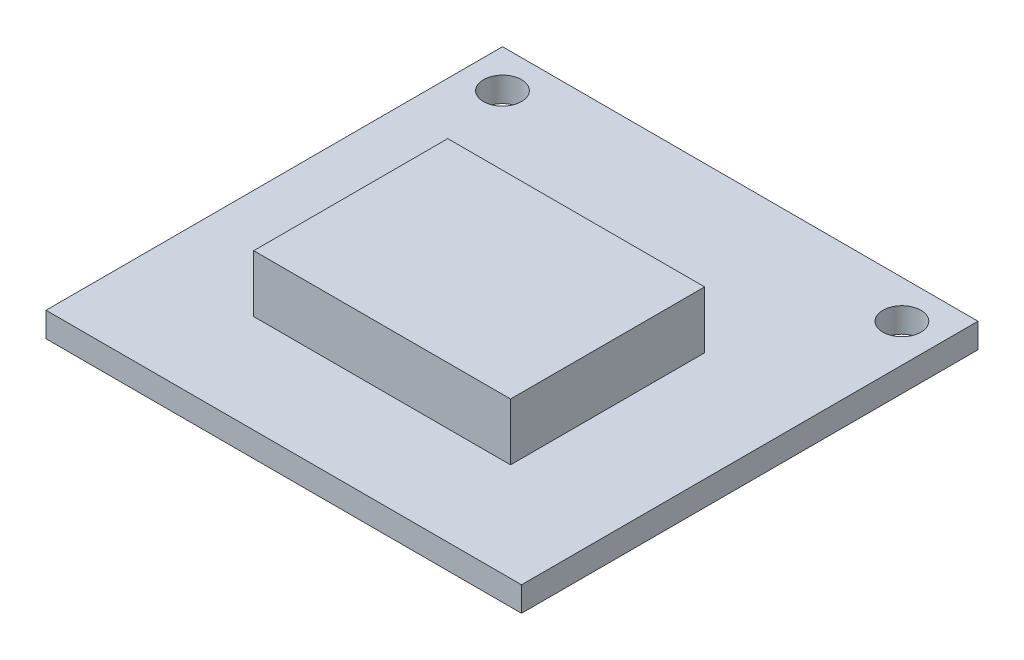
ISO-10303-21;
HEADER;
FILE_DESCRIPTION(('STEP AP214'),'2;1');
FILE_NAME('part.step','',(''),(''),'','','');
FILE_SCHEMA(('AUTOMOTIVE_DESIGN { 1 0 10303 214 1 1 1 1 }'));
ENDSEC;
DATA;
#1=APPLICATION_CONTEXT('core data for automotive mechanical design processes');
#2=APPLICATION_PROTOCOL_DEFINITION('international standard','automotive_design',2000,#1);
#3=PRODUCT_CONTEXT('',#1,'mechanical');
#4=PRODUCT('Part','Part','',(#3));
#5=PRODUCT_RELATED_PRODUCT_CATEGORY('part','',(#4));
#6=PRODUCT_DEFINITION_FORMATION('','',#4);
#7=PRODUCT_DEFINITION_CONTEXT('part definition',#1,'design');
#8=PRODUCT_DEFINITION('design','',#6,#7);
#9=PRODUCT_DEFINITION_SHAPE('','',#8);
#10=(LENGTH_UNIT() NAMED_UNIT(*) SI_UNIT(.MILLI.,.METRE.));
#11=(NAMED_UNIT(*) PLANE_ANGLE_UNIT() SI_UNIT($,.RADIAN.));
#12=(NAMED_UNIT(*) SI_UNIT($,.STERADIAN.) SOLID_ANGLE_UNIT());
#13=UNCERTAINTY_MEASURE_WITH_UNIT(LENGTH_MEASURE(1.E-05),#10,'distance_accuracy_value','');
#14=(GEOMETRIC_REPRESENTATION_CONTEXT(3) GLOBAL_UNCERTAINTY_ASSIGNED_CONTEXT((#13)) GLOBAL_UNIT_ASSIGNED_CONTEXT((#10,
#11,#12)) REPRESENTATION_CONTEXT('',''));
#15=CARTESIAN_POINT('',(0.,0.,0.));
#16=DIRECTION('',(0.,0.,1.));
#17=DIRECTION('',(1.,0.,0.));
#18=AXIS2_PLACEMENT_3D('',#15,#16,#17);
#19=CARTESIAN_POINT('',(0.,1.3,0.));
#20=DIRECTION('',(0.,1.,0.));
#21=DIRECTION('',(0.,0.,1.));
#22=AXIS2_PLACEMENT_3D('',#19,#20,#21);
#23=PLANE('',#22);
#24=DIRECTION('',(0.,0.,-1.));
#25=VECTOR('',#24,1.);
#26=CARTESIAN_POINT('',(6.75144220074146,1.3,-3.37572110037073));
#27=LINE('',#26,#25);
#28=CARTESIAN_POINT('',(6.75144220074146,1.3,6.82874879082627));
#29=VERTEX_POINT('',#28);
#30=CARTESIAN_POINT('',(6.75144220074146,1.3,-3.37572110037073));
#31=VERTEX_POINT('',#30);
#32=EDGE_CURVE('E53',#29,#31,#27,.T.);
#33=ORIENTED_EDGE('',*,*,#32,.F.);
#34=DIRECTION('',(1.,0.,0.));
#35=VECTOR('',#34,1.);
#36=CARTESIAN_POINT('',(-6.75144220074146,1.3,6.82874879082628));
#37=LINE('',#36,#35);
#38=CARTESIAN_POINT('',(-6.75144220074146,1.3,6.82874879082628));
#39=VERTEX_POINT('',#38);
#40=EDGE_CURVE('E59',#39,#29,#37,.T.);
#41=ORIENTED_EDGE('',*,*,#40,.F.);
#42=DIRECTION('',(0.,0.,1.));
#43=VECTOR('',#42,1.);
#44=CARTESIAN_POINT('',(-6.75144220074146,1.3,-3.37572110037073));
#45=LINE('',#44,#43);
#46=CARTESIAN_POINT('',(-6.75144220074146,1.3,-3.37572110037073));
#47=VERTEX_POINT('',#46);
#48=EDGE_CURVE('E307',#47,#39,#45,.T.);
#49=ORIENTED_EDGE('',*,*,#48,.F.);
#50=DIRECTION('',(-1.,0.,0.));
#51=VECTOR('',#50,1.);
#52=CARTESIAN_POINT('',(-6.75144220074146,1.3,-3.37572110037073));
#53=LINE('',#52,#51);
#54=EDGE_CURVE('E311',#31,#47,#53,.T.);
#55=ORIENTED_EDGE('',*,*,#54,.F.);
#56=EDGE_LOOP('',(#33,#41,#49,#55));
#57=FACE_BOUND('',#56,.T.);
#58=CARTESIAN_POINT('',(10.5,1.3,-10.));
#59=DIRECTION('',(0.,1.,0.));
#60=DIRECTION('',(0.,0.,1.));
#61=AXIS2_PLACEMENT_3D('',#58,#59,#60);
#62=CIRCLE('',#61,1.);
#63=CARTESIAN_POINT('',(10.5,1.3,-9.));
#64=VERTEX_POINT('',#63);
#65=EDGE_CURVE('E137',#64,#64,#62,.T.);
#66=ORIENTED_EDGE('',*,*,#65,.F.);
#67=EDGE_LOOP('',(#66));
#68=FACE_BOUND('',#67,.T.);
#69=DIRECTION('',(0.,0.,-1.));
#70=VECTOR('',#69,1.);
#71=CARTESIAN_POINT('',(12.5,1.3,-12.));
#72=LINE('',#71,#70);
#73=CARTESIAN_POINT('',(12.5,1.3,12.));
#74=VERTEX_POINT('',#73);
#75=CARTESIAN_POINT('',(12.5,1.3,-12.));
#76=VERTEX_POINT('',#75);
#77=EDGE_CURVE('E142',#74,#76,#72,.T.);
#78=ORIENTED_EDGE('',*,*,#77,.T.);
#79=DIRECTION('',(-1.,0.,0.));
#80=VECTOR('',#79,1.);
#81=CARTESIAN_POINT('',(-12.5,1.3,-12.));
#82=LINE('',#81,#80);
#83=CARTESIAN_POINT('',(-12.5,1.3,-12.));
#84=VERTEX_POINT('',#83);
#85=EDGE_CURVE('E144',#76,#84,#82,.T.);
#86=ORIENTED_EDGE('',*,*,#85,.T.);
#87=DIRECTION('',(0.,0.,1.));
#88=VECTOR('',#87,1.);
#89=CARTESIAN_POINT('',(-12.5,1.3,-12.));
#90=LINE('',#89,#88);
#91=CARTESIAN_POINT('',(-12.5,1.3,12.));
#92=VERTEX_POINT('',#91);
#93=EDGE_CURVE('E146',#84,#92,#90,.T.);
#94=ORIENTED_EDGE('',*,*,#93,.T.);
#95=DIRECTION('',(1.,0.,0.));
#96=VECTOR('',#95,1.);
#97=CARTESIAN_POINT('',(-12.5,1.3,12.));
#98=LINE('',#97,#96);
#99=EDGE_CURVE('E147',#92,#74,#98,.T.);
#100=ORIENTED_EDGE('',*,*,#99,.T.);
#101=EDGE_LOOP('',(#78,#86,#94,#100));
#102=FACE_BOUND('',#101,.T.);
#103=CARTESIAN_POINT('',(-10.5,1.3,-10.));
#104=DIRECTION('',(0.,1.,0.));
#105=DIRECTION('',(0.,0.,-1.));
#106=AXIS2_PLACEMENT_3D('',#103,#104,#105);
#107=CIRCLE('',#106,1.);
#108=CARTESIAN_POINT('',(-10.5,1.3,-11.));
#109=VERTEX_POINT('',#108);
#110=EDGE_CURVE('E130',#109,#109,#107,.T.);
#111=ORIENTED_EDGE('',*,*,#110,.F.);
#112=EDGE_LOOP('',(#111));
#113=FACE_BOUND('',#112,.T.);
#114=ADVANCED_FACE('F39',(#57,#68,#102,#113),#23,.T.);
#115=CARTESIAN_POINT('',(0.,0.,0.));
#116=DIRECTION('',(0.,1.,0.));
#117=DIRECTION('',(0.,0.,1.));
#118=AXIS2_PLACEMENT_3D('',#115,#116,#117);
#119=PLANE('',#118);
#120=DIRECTION('',(0.,0.,-1.));
#121=VECTOR('',#120,1.);
#122=CARTESIAN_POINT('',(12.5,0.,-12.));
#123=LINE('',#122,#121);
#124=CARTESIAN_POINT('',(12.5,0.,12.));
#125=VERTEX_POINT('',#124);
#126=CARTESIAN_POINT('',(12.5,0.,-12.));
#127=VERTEX_POINT('',#126);
#128=EDGE_CURVE('E139',#125,#127,#123,.T.);
#129=ORIENTED_EDGE('',*,*,#128,.F.);
#130=DIRECTION('',(1.,0.,0.));
#131=VECTOR('',#130,1.);
#132=CARTESIAN_POINT('',(-12.5,0.,12.));
#133=LINE('',#132,#131);
#134=CARTESIAN_POINT('',(-12.5,0.,12.));
#135=VERTEX_POINT('',#134);
#136=EDGE_CURVE('E148',#135,#125,#133,.T.);
#137=ORIENTED_EDGE('',*,*,#136,.F.);
#138=DIRECTION('',(0.,0.,1.));
#139=VECTOR('',#138,1.);
#140=CARTESIAN_POINT('',(-12.5,0.,-12.));
#141=LINE('',#140,#139);
#142=CARTESIAN_POINT('',(-12.5,0.,-12.));
#143=VERTEX_POINT('',#142);
#144=EDGE_CURVE('E160',#143,#135,#141,.T.);
#145=ORIENTED_EDGE('',*,*,#144,.F.);
#146=DIRECTION('',(-1.,0.,0.));
#147=VECTOR('',#146,1.);
#148=CARTESIAN_POINT('',(-12.5,0.,-12.));
#149=LINE('',#148,#147);
#150=EDGE_CURVE('E154',#127,#143,#149,.T.);
#151=ORIENTED_EDGE('',*,*,#150,.F.);
#152=EDGE_LOOP('',(#129,#137,#145,#151));
#153=FACE_BOUND('',#152,.T.);
#154=CARTESIAN_POINT('',(10.5,0.,-10.));
#155=DIRECTION('',(0.,1.,0.));
#156=DIRECTION('',(0.,0.,1.));
#157=AXIS2_PLACEMENT_3D('',#154,#155,#156);
#158=CIRCLE('',#157,1.);
#159=CARTESIAN_POINT('',(10.5,0.,-9.));
#160=VERTEX_POINT('',#159);
#161=EDGE_CURVE('E132',#160,#160,#158,.T.);
#162=ORIENTED_EDGE('',*,*,#161,.T.);
#163=EDGE_LOOP('',(#162));
#164=FACE_BOUND('',#163,.T.);
#165=CARTESIAN_POINT('',(-10.5,0.,-10.));
#166=DIRECTION('',(0.,1.,0.));
#167=DIRECTION('',(0.,0.,-1.));
#168=AXIS2_PLACEMENT_3D('',#165,#166,#167);
#169=CIRCLE('',#168,1.);
#170=CARTESIAN_POINT('',(-10.5,0.,-11.));
#171=VERTEX_POINT('',#170);
#172=EDGE_CURVE('E124',#171,#171,#169,.T.);
#173=ORIENTED_EDGE('',*,*,#172,.T.);
#174=EDGE_LOOP('',(#173));
#175=FACE_BOUND('',#174,.T.);
#176=ADVANCED_FACE('F174',(#153,#164,#175),#119,.F.);
#177=CARTESIAN_POINT('',(12.5,1.3,-12.));
#178=DIRECTION('',(-1.,0.,0.));
#179=DIRECTION('',(0.,0.,1.));
#180=AXIS2_PLACEMENT_3D('',#177,#178,#179);
#181=PLANE('',#180);
#182=ORIENTED_EDGE('',*,*,#128,.T.);
#183=DIRECTION('',(0.,-1.,0.));
#184=VECTOR('',#183,1.);
#185=CARTESIAN_POINT('',(12.5,1.3,-12.));
#186=LINE('',#185,#184);
#187=EDGE_CURVE('E11',#76,#127,#186,.T.);
#188=ORIENTED_EDGE('',*,*,#187,.F.);
#189=ORIENTED_EDGE('',*,*,#77,.F.);
#190=DIRECTION('',(0.,-1.,0.));
#191=VECTOR('',#190,1.);
#192=CARTESIAN_POINT('',(12.5,1.3,12.));
#193=LINE('',#192,#191);
#194=EDGE_CURVE('E155',#74,#125,#193,.T.);
#195=ORIENTED_EDGE('',*,*,#194,.T.);
#196=EDGE_LOOP('',(#182,#188,#189,#195));
#197=FACE_BOUND('',#196,.T.);
#198=ADVANCED_FACE('F41',(#197),#181,.F.);
#199=CARTESIAN_POINT('',(-12.5,1.3,-12.));
#200=DIRECTION('',(0.,0.,1.));
#201=DIRECTION('',(1.,0.,0.));
#202=AXIS2_PLACEMENT_3D('',#199,#200,#201);
#203=PLANE('',#202);
#204=ORIENTED_EDGE('',*,*,#150,.T.);
#205=DIRECTION('',(0.,-1.,0.));
#206=VECTOR('',#205,1.);
#207=CARTESIAN_POINT('',(-12.5,1.3,-12.));
#208=LINE('',#207,#206);
#209=EDGE_CURVE('E50',#84,#143,#208,.T.);
#210=ORIENTED_EDGE('',*,*,#209,.F.);
#211=ORIENTED_EDGE('',*,*,#85,.F.);
#212=ORIENTED_EDGE('',*,*,#187,.T.);
#213=EDGE_LOOP('',(#204,#210,#211,#212));
#214=FACE_BOUND('',#213,.T.);
#215=ADVANCED_FACE('F188',(#214),#203,.F.);
#216=CARTESIAN_POINT('',(-12.5,1.3,-12.));
#217=DIRECTION('',(1.,0.,0.));
#218=DIRECTION('',(0.,0.,-1.));
#219=AXIS2_PLACEMENT_3D('',#216,#217,#218);
#220=PLANE('',#219);
#221=ORIENTED_EDGE('',*,*,#144,.T.);
#222=DIRECTION('',(0.,-1.,0.));
#223=VECTOR('',#222,1.);
#224=CARTESIAN_POINT('',(-12.5,1.3,12.));
#225=LINE('',#224,#223);
#226=EDGE_CURVE('E165',#92,#135,#225,.T.);
#227=ORIENTED_EDGE('',*,*,#226,.F.);
#228=ORIENTED_EDGE('',*,*,#93,.F.);
#229=ORIENTED_EDGE('',*,*,#209,.T.);
#230=EDGE_LOOP('',(#221,#227,#228,#229));
#231=FACE_BOUND('',#230,.T.);
#232=ADVANCED_FACE('F166',(#231),#220,.F.);
#233=CARTESIAN_POINT('',(-12.5,1.3,12.));
#234=DIRECTION('',(0.,0.,-1.));
#235=DIRECTION('',(-1.,0.,0.));
#236=AXIS2_PLACEMENT_3D('',#233,#234,#235);
#237=PLANE('',#236);
#238=ORIENTED_EDGE('',*,*,#136,.T.);
#239=ORIENTED_EDGE('',*,*,#194,.F.);
#240=ORIENTED_EDGE('',*,*,#99,.F.);
#241=ORIENTED_EDGE('',*,*,#226,.T.);
#242=EDGE_LOOP('',(#238,#239,#240,#241));
#243=FACE_BOUND('',#242,.T.);
#244=ADVANCED_FACE('F179',(#243),#237,.F.);
#245=CARTESIAN_POINT('',(10.5,1.3,-10.));
#246=DIRECTION('',(0.,-1.,0.));
#247=DIRECTION('',(0.,0.,-1.));
#248=AXIS2_PLACEMENT_3D('',#245,#246,#247);
#249=CYLINDRICAL_SURFACE('',#248,1.);
#250=ORIENTED_EDGE('',*,*,#65,.T.);
#251=EDGE_LOOP('',(#250));
#252=FACE_BOUND('',#251,.T.);
#253=ORIENTED_EDGE('',*,*,#161,.F.);
#254=EDGE_LOOP('',(#253));
#255=FACE_BOUND('',#254,.T.);
#256=ADVANCED_FACE('F201',(#252,#255),#249,.F.);
#257=CARTESIAN_POINT('',(-10.5,1.3,-10.));
#258=DIRECTION('',(0.,-1.,0.));
#259=DIRECTION('',(0.,0.,-1.));
#260=AXIS2_PLACEMENT_3D('',#257,#258,#259);
#261=CYLINDRICAL_SURFACE('',#260,1.);
#262=ORIENTED_EDGE('',*,*,#110,.T.);
#263=EDGE_LOOP('',(#262));
#264=FACE_BOUND('',#263,.T.);
#265=ORIENTED_EDGE('',*,*,#172,.F.);
#266=EDGE_LOOP('',(#265));
#267=FACE_BOUND('',#266,.T.);
#268=ADVANCED_FACE('F209',(#264,#267),#261,.F.);
#269=CARTESIAN_POINT('',(6.75144220074146,4.3,-3.37572110037073));
#270=DIRECTION('',(-1.,0.,0.));
#271=DIRECTION('',(0.,0.,1.));
#272=AXIS2_PLACEMENT_3D('',#269,#270,#271);
#273=PLANE('',#272);
#274=ORIENTED_EDGE('',*,*,#32,.T.);
#275=DIRECTION('',(0.,-1.,0.));
#276=VECTOR('',#275,1.);
#277=CARTESIAN_POINT('',(6.75144220074146,4.3,-3.37572110037073));
#278=LINE('',#277,#276);
#279=CARTESIAN_POINT('',(6.75144220074146,4.3,-3.37572110037073));
#280=VERTEX_POINT('',#279);
#281=EDGE_CURVE('E110',#280,#31,#278,.T.);
#282=ORIENTED_EDGE('',*,*,#281,.F.);
#283=DIRECTION('',(0.,0.,-1.));
#284=VECTOR('',#283,1.);
#285=CARTESIAN_POINT('',(6.75144220074146,4.3,-3.37572110037073));
#286=LINE('',#285,#284);
#287=CARTESIAN_POINT('',(6.75144220074146,4.3,6.82874879082627));
#288=VERTEX_POINT('',#287);
#289=EDGE_CURVE('E114',#288,#280,#286,.T.);
#290=ORIENTED_EDGE('',*,*,#289,.F.);
#291=DIRECTION('',(0.,-1.,0.));
#292=VECTOR('',#291,1.);
#293=CARTESIAN_POINT('',(6.75144220074146,4.3,6.82874879082627));
#294=LINE('',#293,#292);
#295=EDGE_CURVE('E301',#288,#29,#294,.T.);
#296=ORIENTED_EDGE('',*,*,#295,.T.);
#297=EDGE_LOOP('',(#274,#282,#290,#296));
#298=FACE_BOUND('',#297,.T.);
#299=ADVANCED_FACE('F123',(#298),#273,.F.);
#300=CARTESIAN_POINT('',(-6.75144220074146,4.3,-3.37572110037073));
#301=DIRECTION('',(0.,0.,1.));
#302=DIRECTION('',(1.,0.,0.));
#303=AXIS2_PLACEMENT_3D('',#300,#301,#302);
#304=PLANE('',#303);
#305=ORIENTED_EDGE('',*,*,#54,.T.);
#306=DIRECTION('',(0.,-1.,0.));
#307=VECTOR('',#306,1.);
#308=CARTESIAN_POINT('',(-6.75144220074146,4.3,-3.37572110037073));
#309=LINE('',#308,#307);
#310=CARTESIAN_POINT('',(-6.75144220074146,4.3,-3.37572110037073));
#311=VERTEX_POINT('',#310);
#312=EDGE_CURVE('E108',#311,#47,#309,.T.);
#313=ORIENTED_EDGE('',*,*,#312,.F.);
#314=DIRECTION('',(-1.,0.,0.));
#315=VECTOR('',#314,1.);
#316=CARTESIAN_POINT('',(-6.75144220074146,4.3,-3.37572110037073));
#317=LINE('',#316,#315);
#318=EDGE_CURVE('E105',#280,#311,#317,.T.);
#319=ORIENTED_EDGE('',*,*,#318,.F.);
#320=ORIENTED_EDGE('',*,*,#281,.T.);
#321=EDGE_LOOP('',(#305,#313,#319,#320));
#322=FACE_BOUND('',#321,.T.);
#323=ADVANCED_FACE('F104',(#322),#304,.F.);
#324=CARTESIAN_POINT('',(-6.75144220074146,4.3,-3.37572110037073));
#325=DIRECTION('',(1.,0.,0.));
#326=DIRECTION('',(0.,0.,-1.));
#327=AXIS2_PLACEMENT_3D('',#324,#325,#326);
#328=PLANE('',#327);
#329=ORIENTED_EDGE('',*,*,#48,.T.);
#330=DIRECTION('',(0.,-1.,0.));
#331=VECTOR('',#330,1.);
#332=CARTESIAN_POINT('',(-6.75144220074146,4.3,6.82874879082628));
#333=LINE('',#332,#331);
#334=CARTESIAN_POINT('',(-6.75144220074146,4.3,6.82874879082628));
#335=VERTEX_POINT('',#334);
#336=EDGE_CURVE('E129',#335,#39,#333,.T.);
#337=ORIENTED_EDGE('',*,*,#336,.F.);
#338=DIRECTION('',(0.,0.,1.));
#339=VECTOR('',#338,1.);
#340=CARTESIAN_POINT('',(-6.75144220074146,4.3,-3.37572110037073));
#341=LINE('',#340,#339);
#342=EDGE_CURVE('E115',#311,#335,#341,.T.);
#343=ORIENTED_EDGE('',*,*,#342,.F.);
#344=ORIENTED_EDGE('',*,*,#312,.T.);
#345=EDGE_LOOP('',(#329,#337,#343,#344));
#346=FACE_BOUND('',#345,.T.);
#347=ADVANCED_FACE('F230',(#346),#328,.F.);
#348=CARTESIAN_POINT('',(-6.75144220074146,4.3,6.82874879082628));
#349=DIRECTION('',(0.,0.,-1.));
#350=DIRECTION('',(-1.,0.,0.));
#351=AXIS2_PLACEMENT_3D('',#348,#349,#350);
#352=PLANE('',#351);
#353=ORIENTED_EDGE('',*,*,#40,.T.);
#354=ORIENTED_EDGE('',*,*,#295,.F.);
#355=DIRECTION('',(1.,0.,0.));
#356=VECTOR('',#355,1.);
#357=CARTESIAN_POINT('',(-6.75144220074146,4.3,6.82874879082628));
#358=LINE('',#357,#356);
#359=EDGE_CURVE('E116',#335,#288,#358,.T.);
#360=ORIENTED_EDGE('',*,*,#359,.F.);
#361=ORIENTED_EDGE('',*,*,#336,.T.);
#362=EDGE_LOOP('',(#353,#354,#360,#361));
#363=FACE_BOUND('',#362,.T.);
#364=ADVANCED_FACE('F229',(#363),#352,.F.);
#365=CARTESIAN_POINT('',(0.,4.3,0.));
#366=DIRECTION('',(0.,1.,0.));
#367=DIRECTION('',(0.,0.,1.));
#368=AXIS2_PLACEMENT_3D('',#365,#366,#367);
#369=PLANE('',#368);
#370=ORIENTED_EDGE('',*,*,#289,.T.);
#371=ORIENTED_EDGE('',*,*,#318,.T.);
#372=ORIENTED_EDGE('',*,*,#342,.T.);
#373=ORIENTED_EDGE('',*,*,#359,.T.);
#374=EDGE_LOOP('',(#370,#371,#372,#373));
#375=FACE_BOUND('',#374,.T.);
#376=ADVANCED_FACE('F118',(#375),#369,.T.);
#377=CLOSED_SHELL('',(#114,#176,#198,#215,#232,#244,#256,#268,#299,#323,#347,#364,#376));
#378=MANIFOLD_SOLID_BREP('B2',#377);
#379=ADVANCED_BREP_SHAPE_REPRESENTATION('',(#18,#378),#14);
#380=SHAPE_DEFINITION_REPRESENTATION(#9,#379);
ENDSEC;
END-ISO-10303-21;
